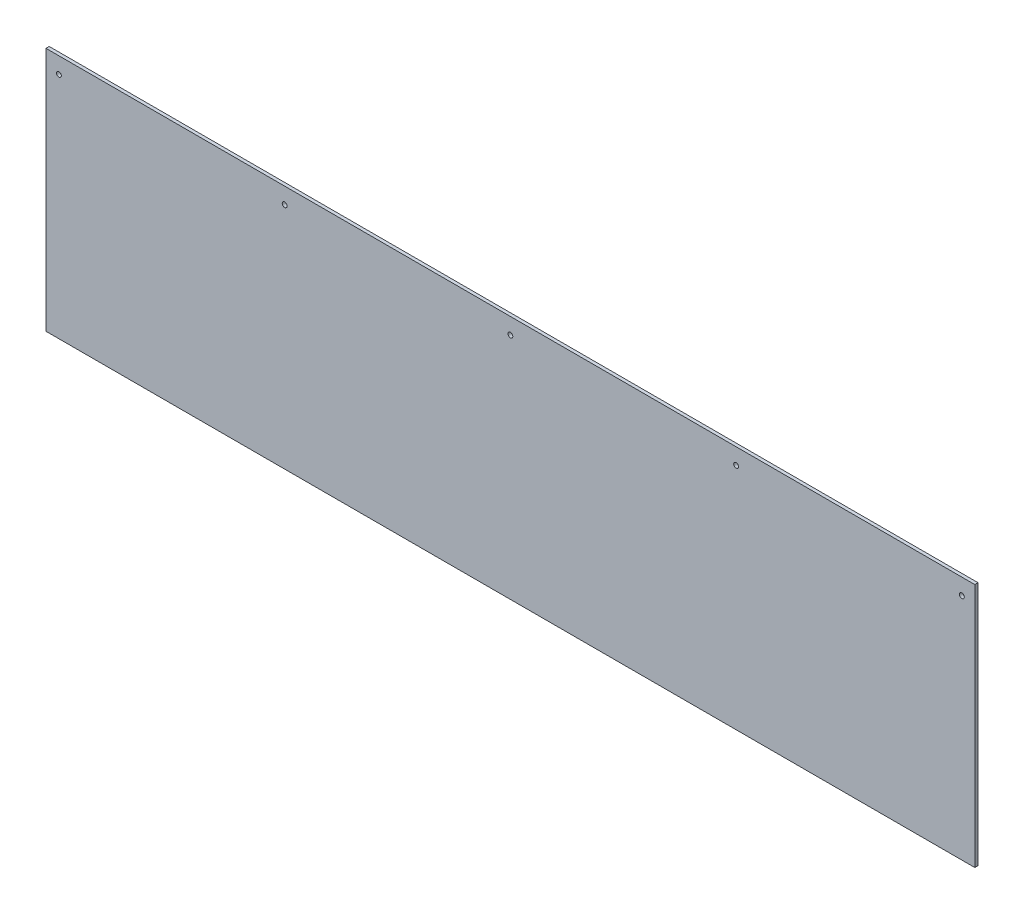
ISO-10303-21;
HEADER;
FILE_DESCRIPTION(('STEP AP214'),'2;1');
FILE_NAME('part.step','',(''),(''),'','','');
FILE_SCHEMA(('AUTOMOTIVE_DESIGN { 1 0 10303 214 1 1 1 1 }'));
ENDSEC;
DATA;
#1=APPLICATION_CONTEXT('core data for automotive mechanical design processes');
#2=APPLICATION_PROTOCOL_DEFINITION('international standard','automotive_design',2000,#1);
#3=PRODUCT_CONTEXT('',#1,'mechanical');
#4=PRODUCT('Part','Part','',(#3));
#5=PRODUCT_RELATED_PRODUCT_CATEGORY('part','',(#4));
#6=PRODUCT_DEFINITION_FORMATION('','',#4);
#7=PRODUCT_DEFINITION_CONTEXT('part definition',#1,'design');
#8=PRODUCT_DEFINITION('design','',#6,#7);
#9=PRODUCT_DEFINITION_SHAPE('','',#8);
#10=(LENGTH_UNIT() NAMED_UNIT(*) SI_UNIT(.MILLI.,.METRE.));
#11=(NAMED_UNIT(*) PLANE_ANGLE_UNIT() SI_UNIT($,.RADIAN.));
#12=(NAMED_UNIT(*) SI_UNIT($,.STERADIAN.) SOLID_ANGLE_UNIT());
#13=UNCERTAINTY_MEASURE_WITH_UNIT(LENGTH_MEASURE(1.E-05),#10,'distance_accuracy_value','');
#14=(GEOMETRIC_REPRESENTATION_CONTEXT(3) GLOBAL_UNCERTAINTY_ASSIGNED_CONTEXT((#13)) GLOBAL_UNIT_ASSIGNED_CONTEXT((#10,
#11,#12)) REPRESENTATION_CONTEXT('',''));
#15=CARTESIAN_POINT('',(0.,0.,0.));
#16=DIRECTION('',(0.,0.,1.));
#17=DIRECTION('',(1.,0.,0.));
#18=AXIS2_PLACEMENT_3D('',#15,#16,#17);
#19=CARTESIAN_POINT('',(0.,0.,6.35));
#20=DIRECTION('',(1.,0.,0.));
#21=DIRECTION('',(0.,0.,-1.));
#22=AXIS2_PLACEMENT_3D('',#19,#20,#21);
#23=PLANE('',#22);
#24=DIRECTION('',(0.,-1.,0.));
#25=VECTOR('',#24,1.);
#26=CARTESIAN_POINT('',(0.,0.,0.));
#27=LINE('',#26,#25);
#28=CARTESIAN_POINT('',(0.,482.6,0.));
#29=VERTEX_POINT('',#28);
#30=CARTESIAN_POINT('',(0.,0.,0.));
#31=VERTEX_POINT('',#30);
#32=EDGE_CURVE('E104',#29,#31,#27,.T.);
#33=ORIENTED_EDGE('',*,*,#32,.T.);
#34=DIRECTION('',(0.,0.,-1.));
#35=VECTOR('',#34,1.);
#36=CARTESIAN_POINT('',(0.,0.,6.35));
#37=LINE('',#36,#35);
#38=CARTESIAN_POINT('',(0.,0.,6.35));
#39=VERTEX_POINT('',#38);
#40=EDGE_CURVE('E11',#39,#31,#37,.T.);
#41=ORIENTED_EDGE('',*,*,#40,.F.);
#42=DIRECTION('',(0.,-1.,0.));
#43=VECTOR('',#42,1.);
#44=CARTESIAN_POINT('',(0.,0.,6.35));
#45=LINE('',#44,#43);
#46=CARTESIAN_POINT('',(0.,482.6,6.35));
#47=VERTEX_POINT('',#46);
#48=EDGE_CURVE('E92',#47,#39,#45,.T.);
#49=ORIENTED_EDGE('',*,*,#48,.F.);
#50=DIRECTION('',(0.,0.,-1.));
#51=VECTOR('',#50,1.);
#52=CARTESIAN_POINT('',(0.,482.6,6.35));
#53=LINE('',#52,#51);
#54=EDGE_CURVE('E100',#47,#29,#53,.T.);
#55=ORIENTED_EDGE('',*,*,#54,.T.);
#56=EDGE_LOOP('',(#33,#41,#49,#55));
#57=FACE_BOUND('',#56,.T.);
#58=ADVANCED_FACE('F41',(#57),#23,.F.);
#59=CARTESIAN_POINT('',(0.,0.,6.35));
#60=DIRECTION('',(0.,1.,0.));
#61=DIRECTION('',(0.,0.,1.));
#62=AXIS2_PLACEMENT_3D('',#59,#60,#61);
#63=PLANE('',#62);
#64=DIRECTION('',(1.,0.,0.));
#65=VECTOR('',#64,1.);
#66=CARTESIAN_POINT('',(0.,0.,0.));
#67=LINE('',#66,#65);
#68=CARTESIAN_POINT('',(1828.8,0.,0.));
#69=VERTEX_POINT('',#68);
#70=EDGE_CURVE('E96',#31,#69,#67,.T.);
#71=ORIENTED_EDGE('',*,*,#70,.T.);
#72=DIRECTION('',(0.,0.,-1.));
#73=VECTOR('',#72,1.);
#74=CARTESIAN_POINT('',(1828.8,0.,6.35));
#75=LINE('',#74,#73);
#76=CARTESIAN_POINT('',(1828.8,0.,6.35));
#77=VERTEX_POINT('',#76);
#78=EDGE_CURVE('E49',#77,#69,#75,.T.);
#79=ORIENTED_EDGE('',*,*,#78,.F.);
#80=DIRECTION('',(1.,0.,0.));
#81=VECTOR('',#80,1.);
#82=CARTESIAN_POINT('',(0.,0.,6.35));
#83=LINE('',#82,#81);
#84=EDGE_CURVE('E87',#39,#77,#83,.T.);
#85=ORIENTED_EDGE('',*,*,#84,.F.);
#86=ORIENTED_EDGE('',*,*,#40,.T.);
#87=EDGE_LOOP('',(#71,#79,#85,#86));
#88=FACE_BOUND('',#87,.T.);
#89=ADVANCED_FACE('F95',(#88),#63,.F.);
#90=CARTESIAN_POINT('',(1828.8,0.,6.35));
#91=DIRECTION('',(-1.,0.,0.));
#92=DIRECTION('',(0.,0.,1.));
#93=AXIS2_PLACEMENT_3D('',#90,#91,#92);
#94=PLANE('',#93);
#95=DIRECTION('',(0.,1.,0.));
#96=VECTOR('',#95,1.);
#97=CARTESIAN_POINT('',(1828.8,0.,0.));
#98=LINE('',#97,#96);
#99=CARTESIAN_POINT('',(1828.8,482.6,0.));
#100=VERTEX_POINT('',#99);
#101=EDGE_CURVE('E74',#69,#100,#98,.T.);
#102=ORIENTED_EDGE('',*,*,#101,.T.);
#103=DIRECTION('',(0.,0.,-1.));
#104=VECTOR('',#103,1.);
#105=CARTESIAN_POINT('',(1828.8,482.6,6.35));
#106=LINE('',#105,#104);
#107=CARTESIAN_POINT('',(1828.8,482.6,6.35));
#108=VERTEX_POINT('',#107);
#109=EDGE_CURVE('E97',#108,#100,#106,.T.);
#110=ORIENTED_EDGE('',*,*,#109,.F.);
#111=DIRECTION('',(0.,1.,0.));
#112=VECTOR('',#111,1.);
#113=CARTESIAN_POINT('',(1828.8,0.,6.35));
#114=LINE('',#113,#112);
#115=EDGE_CURVE('E90',#77,#108,#114,.T.);
#116=ORIENTED_EDGE('',*,*,#115,.F.);
#117=ORIENTED_EDGE('',*,*,#78,.T.);
#118=EDGE_LOOP('',(#102,#110,#116,#117));
#119=FACE_BOUND('',#118,.T.);
#120=ADVANCED_FACE('F98',(#119),#94,.F.);
#121=CARTESIAN_POINT('',(0.,482.6,6.35));
#122=DIRECTION('',(0.,-1.,0.));
#123=DIRECTION('',(1.,0.,0.));
#124=AXIS2_PLACEMENT_3D('',#121,#122,#123);
#125=PLANE('',#124);
#126=DIRECTION('',(-1.,0.,0.));
#127=VECTOR('',#126,1.);
#128=CARTESIAN_POINT('',(0.,482.6,0.));
#129=LINE('',#128,#127);
#130=EDGE_CURVE('E80',#100,#29,#129,.T.);
#131=ORIENTED_EDGE('',*,*,#130,.T.);
#132=ORIENTED_EDGE('',*,*,#54,.F.);
#133=DIRECTION('',(-1.,0.,0.));
#134=VECTOR('',#133,1.);
#135=CARTESIAN_POINT('',(0.,482.6,6.35));
#136=LINE('',#135,#134);
#137=EDGE_CURVE('E57',#108,#47,#136,.T.);
#138=ORIENTED_EDGE('',*,*,#137,.F.);
#139=ORIENTED_EDGE('',*,*,#109,.T.);
#140=EDGE_LOOP('',(#131,#132,#138,#139));
#141=FACE_BOUND('',#140,.T.);
#142=ADVANCED_FACE('F112',(#141),#125,.F.);
#143=CARTESIAN_POINT('',(0.,0.,6.35));
#144=DIRECTION('',(0.,0.,-1.));
#145=DIRECTION('',(-1.,0.,0.));
#146=AXIS2_PLACEMENT_3D('',#143,#144,#145);
#147=PLANE('',#146);
#148=CARTESIAN_POINT('',(25.4,450.85,6.35));
#149=DIRECTION('',(0.,0.,1.));
#150=DIRECTION('',(1.,0.,0.));
#151=AXIS2_PLACEMENT_3D('',#148,#149,#150);
#152=CIRCLE('',#151,4.7625);
#153=CARTESIAN_POINT('',(30.1625,450.85,6.35));
#154=VERTEX_POINT('',#153);
#155=EDGE_CURVE('E142',#154,#154,#152,.T.);
#156=ORIENTED_EDGE('',*,*,#155,.F.);
#157=EDGE_LOOP('',(#156));
#158=FACE_BOUND('',#157,.T.);
#159=CARTESIAN_POINT('',(469.9,450.85,6.35));
#160=DIRECTION('',(0.,0.,1.));
#161=DIRECTION('',(1.,0.,0.));
#162=AXIS2_PLACEMENT_3D('',#159,#160,#161);
#163=CIRCLE('',#162,4.76250000000001);
#164=CARTESIAN_POINT('',(474.6625,450.85,6.35));
#165=VERTEX_POINT('',#164);
#166=EDGE_CURVE('E136',#165,#165,#163,.T.);
#167=ORIENTED_EDGE('',*,*,#166,.F.);
#168=EDGE_LOOP('',(#167));
#169=FACE_BOUND('',#168,.T.);
#170=CARTESIAN_POINT('',(914.4,450.85,6.35));
#171=DIRECTION('',(0.,0.,1.));
#172=DIRECTION('',(1.,0.,0.));
#173=AXIS2_PLACEMENT_3D('',#170,#171,#172);
#174=CIRCLE('',#173,4.76250000000001);
#175=CARTESIAN_POINT('',(919.1625,450.85,6.35));
#176=VERTEX_POINT('',#175);
#177=EDGE_CURVE('E130',#176,#176,#174,.T.);
#178=ORIENTED_EDGE('',*,*,#177,.F.);
#179=EDGE_LOOP('',(#178));
#180=FACE_BOUND('',#179,.T.);
#181=CARTESIAN_POINT('',(1358.9,450.85,6.35));
#182=DIRECTION('',(0.,0.,1.));
#183=DIRECTION('',(1.,0.,0.));
#184=AXIS2_PLACEMENT_3D('',#181,#182,#183);
#185=CIRCLE('',#184,4.7624999999999);
#186=CARTESIAN_POINT('',(1363.6625,450.85,6.35));
#187=VERTEX_POINT('',#186);
#188=EDGE_CURVE('E124',#187,#187,#185,.T.);
#189=ORIENTED_EDGE('',*,*,#188,.F.);
#190=EDGE_LOOP('',(#189));
#191=FACE_BOUND('',#190,.T.);
#192=CARTESIAN_POINT('',(1803.4,450.85,6.35));
#193=DIRECTION('',(0.,0.,1.));
#194=DIRECTION('',(1.,0.,0.));
#195=AXIS2_PLACEMENT_3D('',#192,#193,#194);
#196=CIRCLE('',#195,4.7624999999999);
#197=CARTESIAN_POINT('',(1808.1625,450.85,6.35));
#198=VERTEX_POINT('',#197);
#199=EDGE_CURVE('E118',#198,#198,#196,.T.);
#200=ORIENTED_EDGE('',*,*,#199,.F.);
#201=EDGE_LOOP('',(#200));
#202=FACE_BOUND('',#201,.T.);
#203=ORIENTED_EDGE('',*,*,#48,.T.);
#204=ORIENTED_EDGE('',*,*,#84,.T.);
#205=ORIENTED_EDGE('',*,*,#115,.T.);
#206=ORIENTED_EDGE('',*,*,#137,.T.);
#207=EDGE_LOOP('',(#203,#204,#205,#206));
#208=FACE_BOUND('',#207,.T.);
#209=ADVANCED_FACE('F88',(#158,#169,#180,#191,#202,#208),#147,.F.);
#210=CARTESIAN_POINT('',(0.,0.,0.));
#211=DIRECTION('',(0.,0.,-1.));
#212=DIRECTION('',(-1.,0.,0.));
#213=AXIS2_PLACEMENT_3D('',#210,#211,#212);
#214=PLANE('',#213);
#215=CARTESIAN_POINT('',(25.4,450.85,0.));
#216=DIRECTION('',(0.,0.,1.));
#217=DIRECTION('',(1.,0.,0.));
#218=AXIS2_PLACEMENT_3D('',#215,#216,#217);
#219=CIRCLE('',#218,4.7625);
#220=CARTESIAN_POINT('',(30.1625,450.85,0.));
#221=VERTEX_POINT('',#220);
#222=EDGE_CURVE('E107',#221,#221,#219,.T.);
#223=ORIENTED_EDGE('',*,*,#222,.T.);
#224=EDGE_LOOP('',(#223));
#225=FACE_BOUND('',#224,.T.);
#226=CARTESIAN_POINT('',(469.9,450.85,0.));
#227=DIRECTION('',(0.,0.,1.));
#228=DIRECTION('',(1.,0.,0.));
#229=AXIS2_PLACEMENT_3D('',#226,#227,#228);
#230=CIRCLE('',#229,4.76250000000001);
#231=CARTESIAN_POINT('',(474.6625,450.85,0.));
#232=VERTEX_POINT('',#231);
#233=EDGE_CURVE('E139',#232,#232,#230,.T.);
#234=ORIENTED_EDGE('',*,*,#233,.T.);
#235=EDGE_LOOP('',(#234));
#236=FACE_BOUND('',#235,.T.);
#237=CARTESIAN_POINT('',(914.4,450.85,0.));
#238=DIRECTION('',(0.,0.,1.));
#239=DIRECTION('',(1.,0.,0.));
#240=AXIS2_PLACEMENT_3D('',#237,#238,#239);
#241=CIRCLE('',#240,4.76250000000001);
#242=CARTESIAN_POINT('',(919.1625,450.85,0.));
#243=VERTEX_POINT('',#242);
#244=EDGE_CURVE('E133',#243,#243,#241,.T.);
#245=ORIENTED_EDGE('',*,*,#244,.T.);
#246=EDGE_LOOP('',(#245));
#247=FACE_BOUND('',#246,.T.);
#248=CARTESIAN_POINT('',(1358.9,450.85,0.));
#249=DIRECTION('',(0.,0.,1.));
#250=DIRECTION('',(1.,0.,0.));
#251=AXIS2_PLACEMENT_3D('',#248,#249,#250);
#252=CIRCLE('',#251,4.7624999999999);
#253=CARTESIAN_POINT('',(1363.6625,450.85,0.));
#254=VERTEX_POINT('',#253);
#255=EDGE_CURVE('E127',#254,#254,#252,.T.);
#256=ORIENTED_EDGE('',*,*,#255,.T.);
#257=EDGE_LOOP('',(#256));
#258=FACE_BOUND('',#257,.T.);
#259=CARTESIAN_POINT('',(1803.4,450.85,0.));
#260=DIRECTION('',(0.,0.,1.));
#261=DIRECTION('',(1.,0.,0.));
#262=AXIS2_PLACEMENT_3D('',#259,#260,#261);
#263=CIRCLE('',#262,4.7624999999999);
#264=CARTESIAN_POINT('',(1808.1625,450.85,0.));
#265=VERTEX_POINT('',#264);
#266=EDGE_CURVE('E121',#265,#265,#263,.T.);
#267=ORIENTED_EDGE('',*,*,#266,.T.);
#268=EDGE_LOOP('',(#267));
#269=FACE_BOUND('',#268,.T.);
#270=ORIENTED_EDGE('',*,*,#32,.F.);
#271=ORIENTED_EDGE('',*,*,#130,.F.);
#272=ORIENTED_EDGE('',*,*,#101,.F.);
#273=ORIENTED_EDGE('',*,*,#70,.F.);
#274=EDGE_LOOP('',(#270,#271,#272,#273));
#275=FACE_BOUND('',#274,.T.);
#276=ADVANCED_FACE('F115',(#225,#236,#247,#258,#269,#275),#214,.T.);
#277=CARTESIAN_POINT('',(1803.4,450.85,0.));
#278=DIRECTION('',(0.,0.,1.));
#279=DIRECTION('',(1.,0.,0.));
#280=AXIS2_PLACEMENT_3D('',#277,#278,#279);
#281=CYLINDRICAL_SURFACE('',#280,4.7624999999999);
#282=ORIENTED_EDGE('',*,*,#266,.F.);
#283=EDGE_LOOP('',(#282));
#284=FACE_BOUND('',#283,.T.);
#285=ORIENTED_EDGE('',*,*,#199,.T.);
#286=EDGE_LOOP('',(#285));
#287=FACE_BOUND('',#286,.T.);
#288=ADVANCED_FACE('F168',(#284,#287),#281,.F.);
#289=CARTESIAN_POINT('',(1358.9,450.85,0.));
#290=DIRECTION('',(0.,0.,1.));
#291=DIRECTION('',(1.,0.,0.));
#292=AXIS2_PLACEMENT_3D('',#289,#290,#291);
#293=CYLINDRICAL_SURFACE('',#292,4.7624999999999);
#294=ORIENTED_EDGE('',*,*,#255,.F.);
#295=EDGE_LOOP('',(#294));
#296=FACE_BOUND('',#295,.T.);
#297=ORIENTED_EDGE('',*,*,#188,.T.);
#298=EDGE_LOOP('',(#297));
#299=FACE_BOUND('',#298,.T.);
#300=ADVANCED_FACE('F170',(#296,#299),#293,.F.);
#301=CARTESIAN_POINT('',(914.4,450.85,0.));
#302=DIRECTION('',(0.,0.,1.));
#303=DIRECTION('',(1.,0.,0.));
#304=AXIS2_PLACEMENT_3D('',#301,#302,#303);
#305=CYLINDRICAL_SURFACE('',#304,4.76250000000001);
#306=ORIENTED_EDGE('',*,*,#244,.F.);
#307=EDGE_LOOP('',(#306));
#308=FACE_BOUND('',#307,.T.);
#309=ORIENTED_EDGE('',*,*,#177,.T.);
#310=EDGE_LOOP('',(#309));
#311=FACE_BOUND('',#310,.T.);
#312=ADVANCED_FACE('F177',(#308,#311),#305,.F.);
#313=CARTESIAN_POINT('',(469.9,450.85,0.));
#314=DIRECTION('',(0.,0.,1.));
#315=DIRECTION('',(1.,0.,0.));
#316=AXIS2_PLACEMENT_3D('',#313,#314,#315);
#317=CYLINDRICAL_SURFACE('',#316,4.76250000000001);
#318=ORIENTED_EDGE('',*,*,#233,.F.);
#319=EDGE_LOOP('',(#318));
#320=FACE_BOUND('',#319,.T.);
#321=ORIENTED_EDGE('',*,*,#166,.T.);
#322=EDGE_LOOP('',(#321));
#323=FACE_BOUND('',#322,.T.);
#324=ADVANCED_FACE('F153',(#320,#323),#317,.F.);
#325=CARTESIAN_POINT('',(25.4,450.85,0.));
#326=DIRECTION('',(0.,0.,1.));
#327=DIRECTION('',(1.,0.,0.));
#328=AXIS2_PLACEMENT_3D('',#325,#326,#327);
#329=CYLINDRICAL_SURFACE('',#328,4.7625);
#330=ORIENTED_EDGE('',*,*,#222,.F.);
#331=EDGE_LOOP('',(#330));
#332=FACE_BOUND('',#331,.T.);
#333=ORIENTED_EDGE('',*,*,#155,.T.);
#334=EDGE_LOOP('',(#333));
#335=FACE_BOUND('',#334,.T.);
#336=ADVANCED_FACE('F150',(#332,#335),#329,.F.);
#337=CLOSED_SHELL('',(#58,#89,#120,#142,#209,#276,#288,#300,#312,#324,#336));
#338=MANIFOLD_SOLID_BREP('B2',#337);
#339=ADVANCED_BREP_SHAPE_REPRESENTATION('',(#18,#338),#14);
#340=SHAPE_DEFINITION_REPRESENTATION(#9,#339);
ENDSEC;
END-ISO-10303-21;
